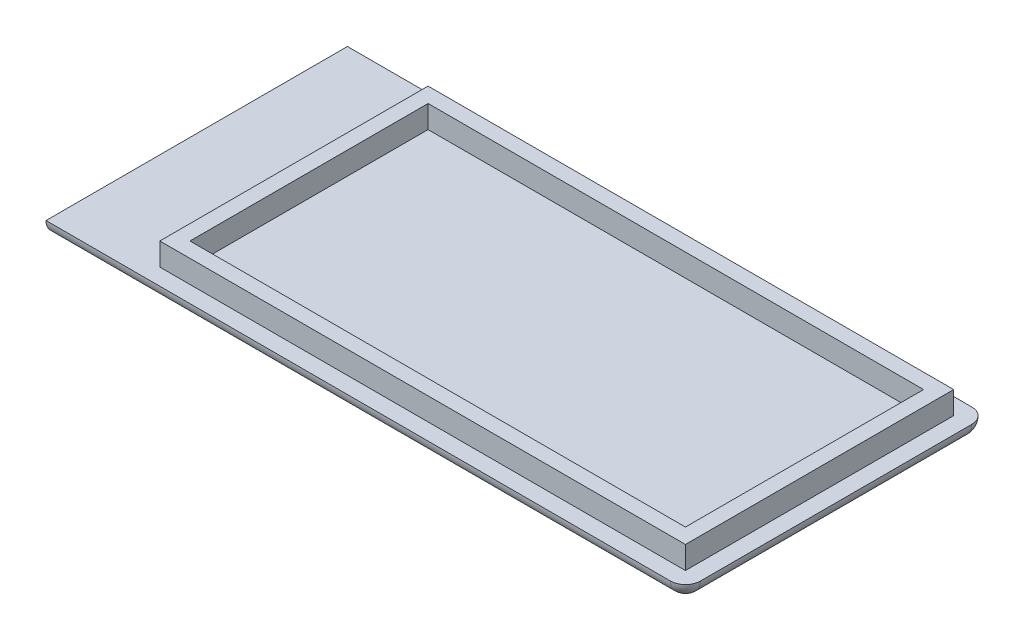
ISO-10303-21;
HEADER;
FILE_DESCRIPTION(('STEP AP214'),'2;1');
FILE_NAME('part.step','',(''),(''),'','','');
FILE_SCHEMA(('AUTOMOTIVE_DESIGN { 1 0 10303 214 1 1 1 1 }'));
ENDSEC;
DATA;
#1=APPLICATION_CONTEXT('core data for automotive mechanical design processes');
#2=APPLICATION_PROTOCOL_DEFINITION('international standard','automotive_design',2000,#1);
#3=PRODUCT_CONTEXT('',#1,'mechanical');
#4=PRODUCT('Part','Part','',(#3));
#5=PRODUCT_RELATED_PRODUCT_CATEGORY('part','',(#4));
#6=PRODUCT_DEFINITION_FORMATION('','',#4);
#7=PRODUCT_DEFINITION_CONTEXT('part definition',#1,'design');
#8=PRODUCT_DEFINITION('design','',#6,#7);
#9=PRODUCT_DEFINITION_SHAPE('','',#8);
#10=(LENGTH_UNIT() NAMED_UNIT(*) SI_UNIT(.MILLI.,.METRE.));
#11=(NAMED_UNIT(*) PLANE_ANGLE_UNIT() SI_UNIT($,.RADIAN.));
#12=(NAMED_UNIT(*) SI_UNIT($,.STERADIAN.) SOLID_ANGLE_UNIT());
#13=UNCERTAINTY_MEASURE_WITH_UNIT(LENGTH_MEASURE(1.E-05),#10,'distance_accuracy_value','');
#14=(GEOMETRIC_REPRESENTATION_CONTEXT(3) GLOBAL_UNCERTAINTY_ASSIGNED_CONTEXT((#13)) GLOBAL_UNIT_ASSIGNED_CONTEXT((#10,
#11,#12)) REPRESENTATION_CONTEXT('',''));
#15=CARTESIAN_POINT('',(0.,0.,0.));
#16=DIRECTION('',(0.,0.,1.));
#17=DIRECTION('',(1.,0.,0.));
#18=AXIS2_PLACEMENT_3D('',#15,#16,#17);
#19=CARTESIAN_POINT('',(0.,1.,19.99996));
#20=DIRECTION('',(0.,-1.,0.));
#21=DIRECTION('',(0.,0.,-1.));
#22=AXIS2_PLACEMENT_3D('',#19,#20,#21);
#23=PLANE('',#22);
#24=DIRECTION('',(-1.,0.,0.));
#25=VECTOR('',#24,1.);
#26=CARTESIAN_POINT('',(0.,1.,19.99996));
#27=LINE('',#26,#25);
#28=CARTESIAN_POINT('',(41.42562,1.,19.99996));
#29=VERTEX_POINT('',#28);
#30=CARTESIAN_POINT('',(0.,1.,19.99996));
#31=VERTEX_POINT('',#30);
#32=EDGE_CURVE('E198',#29,#31,#27,.T.);
#33=ORIENTED_EDGE('',*,*,#32,.F.);
#34=CARTESIAN_POINT('',(41.42562,1.,18.99996));
#35=DIRECTION('',(0.,-1.,0.));
#36=DIRECTION('',(0.,0.,-1.));
#37=AXIS2_PLACEMENT_3D('',#34,#35,#36);
#38=CIRCLE('',#37,1.);
#39=CARTESIAN_POINT('',(42.42562,1.,18.99996));
#40=VERTEX_POINT('',#39);
#41=EDGE_CURVE('E213',#29,#40,#38,.F.);
#42=ORIENTED_EDGE('',*,*,#41,.T.);
#43=DIRECTION('',(0.,0.,-1.));
#44=VECTOR('',#43,1.);
#45=CARTESIAN_POINT('',(42.42562,1.,19.99996));
#46=LINE('',#45,#44);
#47=CARTESIAN_POINT('',(42.42562,1.,1.));
#48=VERTEX_POINT('',#47);
#49=EDGE_CURVE('E206',#40,#48,#46,.T.);
#50=ORIENTED_EDGE('',*,*,#49,.T.);
#51=CARTESIAN_POINT('',(41.42562,1.,1.));
#52=DIRECTION('',(0.,-1.,0.));
#53=DIRECTION('',(0.,0.,-1.));
#54=AXIS2_PLACEMENT_3D('',#51,#52,#53);
#55=CIRCLE('',#54,1.);
#56=CARTESIAN_POINT('',(41.42562,1.,0.));
#57=VERTEX_POINT('',#56);
#58=EDGE_CURVE('E211',#48,#57,#55,.F.);
#59=ORIENTED_EDGE('',*,*,#58,.T.);
#60=DIRECTION('',(-1.,0.,0.));
#61=VECTOR('',#60,1.);
#62=CARTESIAN_POINT('',(0.,1.,0.));
#63=LINE('',#62,#61);
#64=CARTESIAN_POINT('',(0.,1.,0.));
#65=VERTEX_POINT('',#64);
#66=EDGE_CURVE('E202',#57,#65,#63,.T.);
#67=ORIENTED_EDGE('',*,*,#66,.T.);
#68=DIRECTION('',(0.,0.,-1.));
#69=VECTOR('',#68,1.);
#70=CARTESIAN_POINT('',(0.,1.,19.99996));
#71=LINE('',#70,#69);
#72=EDGE_CURVE('E201',#31,#65,#71,.T.);
#73=ORIENTED_EDGE('',*,*,#72,.F.);
#74=EDGE_LOOP('',(#33,#42,#50,#59,#67,#73));
#75=FACE_BOUND('',#74,.T.);
#76=DIRECTION('',(0.,0.,1.));
#77=VECTOR('',#76,1.);
#78=CARTESIAN_POINT('',(6.45142,1.,1.1));
#79=LINE('',#78,#77);
#80=CARTESIAN_POINT('',(6.45142,1.,1.1));
#81=VERTEX_POINT('',#80);
#82=CARTESIAN_POINT('',(6.45142,1.,18.89996));
#83=VERTEX_POINT('',#82);
#84=EDGE_CURVE('E146',#81,#83,#79,.T.);
#85=ORIENTED_EDGE('',*,*,#84,.F.);
#86=DIRECTION('',(-1.,0.,0.));
#87=VECTOR('',#86,1.);
#88=CARTESIAN_POINT('',(6.45142,1.,1.1));
#89=LINE('',#88,#87);
#90=CARTESIAN_POINT('',(41.32562,1.,1.1));
#91=VERTEX_POINT('',#90);
#92=EDGE_CURVE('E174',#91,#81,#89,.T.);
#93=ORIENTED_EDGE('',*,*,#92,.F.);
#94=DIRECTION('',(0.,0.,-1.));
#95=VECTOR('',#94,1.);
#96=CARTESIAN_POINT('',(41.32562,1.,1.1));
#97=LINE('',#96,#95);
#98=CARTESIAN_POINT('',(41.32562,1.,18.89996));
#99=VERTEX_POINT('',#98);
#100=EDGE_CURVE('E55',#99,#91,#97,.T.);
#101=ORIENTED_EDGE('',*,*,#100,.F.);
#102=DIRECTION('',(1.,0.,0.));
#103=VECTOR('',#102,1.);
#104=CARTESIAN_POINT('',(6.45142,1.,18.89996));
#105=LINE('',#104,#103);
#106=EDGE_CURVE('E50',#83,#99,#105,.T.);
#107=ORIENTED_EDGE('',*,*,#106,.F.);
#108=EDGE_LOOP('',(#85,#93,#101,#107));
#109=FACE_BOUND('',#108,.T.);
#110=ADVANCED_FACE('F33',(#75,#109),#23,.F.);
#111=CARTESIAN_POINT('',(0.,0.,19.99996));
#112=DIRECTION('',(1.,0.,0.));
#113=DIRECTION('',(0.,0.,-1.));
#114=AXIS2_PLACEMENT_3D('',#111,#112,#113);
#115=PLANE('',#114);
#116=ORIENTED_EDGE('',*,*,#72,.T.);
#117=CARTESIAN_POINT('',(0.,1.,1.));
#118=DIRECTION('',(1.,0.,0.));
#119=DIRECTION('',(0.,0.,-1.));
#120=AXIS2_PLACEMENT_3D('',#117,#118,#119);
#121=CIRCLE('',#120,1.);
#122=CARTESIAN_POINT('',(0.,0.,1.));
#123=VERTEX_POINT('',#122);
#124=EDGE_CURVE('E11',#65,#123,#121,.F.);
#125=ORIENTED_EDGE('',*,*,#124,.T.);
#126=DIRECTION('',(0.,0.,-1.));
#127=VECTOR('',#126,1.);
#128=CARTESIAN_POINT('',(0.,0.,19.99996));
#129=LINE('',#128,#127);
#130=CARTESIAN_POINT('',(0.,0.,18.99996));
#131=VERTEX_POINT('',#130);
#132=EDGE_CURVE('E208',#131,#123,#129,.T.);
#133=ORIENTED_EDGE('',*,*,#132,.F.);
#134=CARTESIAN_POINT('',(0.,1.,18.99996));
#135=DIRECTION('',(1.,0.,0.));
#136=DIRECTION('',(0.,0.,-1.));
#137=AXIS2_PLACEMENT_3D('',#134,#135,#136);
#138=CIRCLE('',#137,1.);
#139=EDGE_CURVE('E42',#131,#31,#138,.F.);
#140=ORIENTED_EDGE('',*,*,#139,.T.);
#141=EDGE_LOOP('',(#116,#125,#133,#140));
#142=FACE_BOUND('',#141,.T.);
#143=ADVANCED_FACE('F244',(#142),#115,.F.);
#144=CARTESIAN_POINT('',(0.,0.,19.99996));
#145=DIRECTION('',(0.,1.,0.));
#146=DIRECTION('',(0.,0.,1.));
#147=AXIS2_PLACEMENT_3D('',#144,#145,#146);
#148=PLANE('',#147);
#149=ORIENTED_EDGE('',*,*,#132,.T.);
#150=DIRECTION('',(1.,0.,0.));
#151=VECTOR('',#150,1.);
#152=CARTESIAN_POINT('',(42.42562,0.,1.));
#153=LINE('',#152,#151);
#154=CARTESIAN_POINT('',(41.42562,0.,1.));
#155=VERTEX_POINT('',#154);
#156=EDGE_CURVE('E220',#123,#155,#153,.T.);
#157=ORIENTED_EDGE('',*,*,#156,.T.);
#158=DIRECTION('',(0.,0.,-1.));
#159=VECTOR('',#158,1.);
#160=CARTESIAN_POINT('',(41.42562,0.,19.99996));
#161=LINE('',#160,#159);
#162=CARTESIAN_POINT('',(41.42562,0.,18.99996));
#163=VERTEX_POINT('',#162);
#164=EDGE_CURVE('E218',#155,#163,#161,.F.);
#165=ORIENTED_EDGE('',*,*,#164,.T.);
#166=DIRECTION('',(1.,0.,0.));
#167=VECTOR('',#166,1.);
#168=CARTESIAN_POINT('',(0.,0.,18.99996));
#169=LINE('',#168,#167);
#170=EDGE_CURVE('E216',#163,#131,#169,.F.);
#171=ORIENTED_EDGE('',*,*,#170,.T.);
#172=EDGE_LOOP('',(#149,#157,#165,#171));
#173=FACE_BOUND('',#172,.T.);
#174=ADVANCED_FACE('F269',(#173),#148,.F.);
#175=CARTESIAN_POINT('',(0.,1.,1.));
#176=DIRECTION('',(-1.,0.,0.));
#177=DIRECTION('',(0.,0.,1.));
#178=AXIS2_PLACEMENT_3D('',#175,#176,#177);
#179=CYLINDRICAL_SURFACE('',#178,1.);
#180=ORIENTED_EDGE('',*,*,#124,.F.);
#181=ORIENTED_EDGE('',*,*,#66,.F.);
#182=CARTESIAN_POINT('',(41.42562,1.,1.));
#183=DIRECTION('',(1.,0.,0.));
#184=DIRECTION('',(0.,0.,-1.));
#185=AXIS2_PLACEMENT_3D('',#182,#183,#184);
#186=CIRCLE('',#185,1.);
#187=EDGE_CURVE('E37',#155,#57,#186,.T.);
#188=ORIENTED_EDGE('',*,*,#187,.F.);
#189=ORIENTED_EDGE('',*,*,#156,.F.);
#190=EDGE_LOOP('',(#180,#181,#188,#189));
#191=FACE_BOUND('',#190,.T.);
#192=ADVANCED_FACE('F35',(#191),#179,.T.);
#193=CARTESIAN_POINT('',(41.42562,1.,1.));
#194=DIRECTION('',(0.,0.,1.));
#195=DIRECTION('',(1.,0.,0.));
#196=AXIS2_PLACEMENT_3D('',#193,#194,#195);
#197=SPHERICAL_SURFACE('',#196,1.);
#198=ORIENTED_EDGE('',*,*,#187,.T.);
#199=ORIENTED_EDGE('',*,*,#58,.F.);
#200=CARTESIAN_POINT('',(41.42562,1.,1.));
#201=DIRECTION('',(0.,0.,-1.));
#202=DIRECTION('',(-1.,0.,0.));
#203=AXIS2_PLACEMENT_3D('',#200,#201,#202);
#204=CIRCLE('',#203,1.);
#205=EDGE_CURVE('E226',#155,#48,#204,.F.);
#206=ORIENTED_EDGE('',*,*,#205,.F.);
#207=EDGE_LOOP('',(#198,#199,#206));
#208=FACE_BOUND('',#207,.T.);
#209=ADVANCED_FACE('F236',(#208),#197,.T.);
#210=CARTESIAN_POINT('',(41.42562,1.,19.99996));
#211=DIRECTION('',(0.,0.,-1.));
#212=DIRECTION('',(-1.,0.,0.));
#213=AXIS2_PLACEMENT_3D('',#210,#211,#212);
#214=CYLINDRICAL_SURFACE('',#213,1.);
#215=ORIENTED_EDGE('',*,*,#205,.T.);
#216=ORIENTED_EDGE('',*,*,#49,.F.);
#217=CARTESIAN_POINT('',(41.42562,1.,18.99996));
#218=DIRECTION('',(0.,0.,1.));
#219=DIRECTION('',(1.,0.,0.));
#220=AXIS2_PLACEMENT_3D('',#217,#218,#219);
#221=CIRCLE('',#220,1.);
#222=EDGE_CURVE('E225',#163,#40,#221,.T.);
#223=ORIENTED_EDGE('',*,*,#222,.F.);
#224=ORIENTED_EDGE('',*,*,#164,.F.);
#225=EDGE_LOOP('',(#215,#216,#223,#224));
#226=FACE_BOUND('',#225,.T.);
#227=ADVANCED_FACE('F255',(#226),#214,.T.);
#228=CARTESIAN_POINT('',(0.,1.,18.99996));
#229=DIRECTION('',(1.,0.,0.));
#230=DIRECTION('',(0.,0.,-1.));
#231=AXIS2_PLACEMENT_3D('',#228,#229,#230);
#232=CYLINDRICAL_SURFACE('',#231,1.);
#233=ORIENTED_EDGE('',*,*,#139,.F.);
#234=ORIENTED_EDGE('',*,*,#170,.F.);
#235=CARTESIAN_POINT('',(41.42562,1.,18.99996));
#236=DIRECTION('',(1.,0.,0.));
#237=DIRECTION('',(0.,0.,-1.));
#238=AXIS2_PLACEMENT_3D('',#235,#236,#237);
#239=CIRCLE('',#238,1.);
#240=EDGE_CURVE('E197',#29,#163,#239,.T.);
#241=ORIENTED_EDGE('',*,*,#240,.F.);
#242=ORIENTED_EDGE('',*,*,#32,.T.);
#243=EDGE_LOOP('',(#233,#234,#241,#242));
#244=FACE_BOUND('',#243,.T.);
#245=ADVANCED_FACE('F249',(#244),#232,.T.);
#246=CARTESIAN_POINT('',(41.42562,1.,18.99996));
#247=DIRECTION('',(0.,0.,1.));
#248=DIRECTION('',(1.,0.,0.));
#249=AXIS2_PLACEMENT_3D('',#246,#247,#248);
#250=SPHERICAL_SURFACE('',#249,1.);
#251=ORIENTED_EDGE('',*,*,#41,.F.);
#252=ORIENTED_EDGE('',*,*,#240,.T.);
#253=ORIENTED_EDGE('',*,*,#222,.T.);
#254=EDGE_LOOP('',(#251,#252,#253));
#255=FACE_BOUND('',#254,.T.);
#256=ADVANCED_FACE('F254',(#255),#250,.T.);
#257=CARTESIAN_POINT('',(0.,2.5,0.));
#258=DIRECTION('',(0.,1.,0.));
#259=DIRECTION('',(0.,0.,1.));
#260=AXIS2_PLACEMENT_3D('',#257,#258,#259);
#261=PLANE('',#260);
#262=DIRECTION('',(0.,0.,1.));
#263=VECTOR('',#262,1.);
#264=CARTESIAN_POINT('',(6.45142,2.5,1.1));
#265=LINE('',#264,#263);
#266=CARTESIAN_POINT('',(6.45142,2.5,1.1));
#267=VERTEX_POINT('',#266);
#268=CARTESIAN_POINT('',(6.45142,2.5,18.89996));
#269=VERTEX_POINT('',#268);
#270=EDGE_CURVE('E170',#267,#269,#265,.T.);
#271=ORIENTED_EDGE('',*,*,#270,.T.);
#272=DIRECTION('',(1.,0.,0.));
#273=VECTOR('',#272,1.);
#274=CARTESIAN_POINT('',(6.45142,2.5,18.89996));
#275=LINE('',#274,#273);
#276=CARTESIAN_POINT('',(41.32562,2.5,18.89996));
#277=VERTEX_POINT('',#276);
#278=EDGE_CURVE('E173',#269,#277,#275,.T.);
#279=ORIENTED_EDGE('',*,*,#278,.T.);
#280=DIRECTION('',(0.,0.,-1.));
#281=VECTOR('',#280,1.);
#282=CARTESIAN_POINT('',(41.32562,2.5,1.1));
#283=LINE('',#282,#281);
#284=CARTESIAN_POINT('',(41.32562,2.5,1.1));
#285=VERTEX_POINT('',#284);
#286=EDGE_CURVE('E176',#277,#285,#283,.T.);
#287=ORIENTED_EDGE('',*,*,#286,.T.);
#288=DIRECTION('',(-1.,0.,0.));
#289=VECTOR('',#288,1.);
#290=CARTESIAN_POINT('',(6.45142,2.5,1.1));
#291=LINE('',#290,#289);
#292=EDGE_CURVE('E178',#285,#267,#291,.T.);
#293=ORIENTED_EDGE('',*,*,#292,.T.);
#294=EDGE_LOOP('',(#271,#279,#287,#293));
#295=FACE_BOUND('',#294,.T.);
#296=DIRECTION('',(0.,0.,1.));
#297=VECTOR('',#296,1.);
#298=CARTESIAN_POINT('',(7.45142,2.5,2.1));
#299=LINE('',#298,#297);
#300=CARTESIAN_POINT('',(7.45142,2.5,2.1));
#301=VERTEX_POINT('',#300);
#302=CARTESIAN_POINT('',(7.45142,2.5,17.89996));
#303=VERTEX_POINT('',#302);
#304=EDGE_CURVE('E138',#301,#303,#299,.T.);
#305=ORIENTED_EDGE('',*,*,#304,.F.);
#306=DIRECTION('',(-1.,0.,0.));
#307=VECTOR('',#306,1.);
#308=CARTESIAN_POINT('',(7.45142,2.5,2.1));
#309=LINE('',#308,#307);
#310=CARTESIAN_POINT('',(40.32562,2.5,2.1));
#311=VERTEX_POINT('',#310);
#312=EDGE_CURVE('E128',#311,#301,#309,.T.);
#313=ORIENTED_EDGE('',*,*,#312,.F.);
#314=DIRECTION('',(0.,0.,-1.));
#315=VECTOR('',#314,1.);
#316=CARTESIAN_POINT('',(40.32562,2.5,2.1));
#317=LINE('',#316,#315);
#318=CARTESIAN_POINT('',(40.32562,2.5,17.89996));
#319=VERTEX_POINT('',#318);
#320=EDGE_CURVE('E154',#319,#311,#317,.T.);
#321=ORIENTED_EDGE('',*,*,#320,.F.);
#322=DIRECTION('',(1.,0.,0.));
#323=VECTOR('',#322,1.);
#324=CARTESIAN_POINT('',(7.45142,2.5,17.89996));
#325=LINE('',#324,#323);
#326=EDGE_CURVE('E152',#303,#319,#325,.T.);
#327=ORIENTED_EDGE('',*,*,#326,.F.);
#328=EDGE_LOOP('',(#305,#313,#321,#327));
#329=FACE_BOUND('',#328,.T.);
#330=ADVANCED_FACE('F150',(#295,#329),#261,.T.);
#331=CARTESIAN_POINT('',(6.45142,2.5,1.1));
#332=DIRECTION('',(1.,0.,0.));
#333=DIRECTION('',(0.,0.,-1.));
#334=AXIS2_PLACEMENT_3D('',#331,#332,#333);
#335=PLANE('',#334);
#336=ORIENTED_EDGE('',*,*,#84,.T.);
#337=DIRECTION('',(0.,-1.,0.));
#338=VECTOR('',#337,1.);
#339=CARTESIAN_POINT('',(6.45142,2.5,18.89996));
#340=LINE('',#339,#338);
#341=EDGE_CURVE('E195',#269,#83,#340,.T.);
#342=ORIENTED_EDGE('',*,*,#341,.F.);
#343=ORIENTED_EDGE('',*,*,#270,.F.);
#344=DIRECTION('',(0.,-1.,0.));
#345=VECTOR('',#344,1.);
#346=CARTESIAN_POINT('',(6.45142,2.5,1.1));
#347=LINE('',#346,#345);
#348=EDGE_CURVE('E180',#267,#81,#347,.T.);
#349=ORIENTED_EDGE('',*,*,#348,.T.);
#350=EDGE_LOOP('',(#336,#342,#343,#349));
#351=FACE_BOUND('',#350,.T.);
#352=ADVANCED_FACE('F297',(#351),#335,.F.);
#353=CARTESIAN_POINT('',(6.45142,2.5,18.89996));
#354=DIRECTION('',(0.,0.,-1.));
#355=DIRECTION('',(-1.,0.,0.));
#356=AXIS2_PLACEMENT_3D('',#353,#354,#355);
#357=PLANE('',#356);
#358=ORIENTED_EDGE('',*,*,#106,.T.);
#359=DIRECTION('',(0.,-1.,0.));
#360=VECTOR('',#359,1.);
#361=CARTESIAN_POINT('',(41.32562,2.5,18.89996));
#362=LINE('',#361,#360);
#363=EDGE_CURVE('E192',#277,#99,#362,.T.);
#364=ORIENTED_EDGE('',*,*,#363,.F.);
#365=ORIENTED_EDGE('',*,*,#278,.F.);
#366=ORIENTED_EDGE('',*,*,#341,.T.);
#367=EDGE_LOOP('',(#358,#364,#365,#366));
#368=FACE_BOUND('',#367,.T.);
#369=ADVANCED_FACE('F305',(#368),#357,.F.);
#370=CARTESIAN_POINT('',(41.32562,2.5,1.1));
#371=DIRECTION('',(-1.,0.,0.));
#372=DIRECTION('',(0.,0.,1.));
#373=AXIS2_PLACEMENT_3D('',#370,#371,#372);
#374=PLANE('',#373);
#375=ORIENTED_EDGE('',*,*,#100,.T.);
#376=DIRECTION('',(0.,-1.,0.));
#377=VECTOR('',#376,1.);
#378=CARTESIAN_POINT('',(41.32562,2.5,1.1));
#379=LINE('',#378,#377);
#380=EDGE_CURVE('E189',#285,#91,#379,.T.);
#381=ORIENTED_EDGE('',*,*,#380,.F.);
#382=ORIENTED_EDGE('',*,*,#286,.F.);
#383=ORIENTED_EDGE('',*,*,#363,.T.);
#384=EDGE_LOOP('',(#375,#381,#382,#383));
#385=FACE_BOUND('',#384,.T.);
#386=ADVANCED_FACE('F301',(#385),#374,.F.);
#387=CARTESIAN_POINT('',(6.45142,2.5,1.1));
#388=DIRECTION('',(0.,0.,1.));
#389=DIRECTION('',(1.,0.,0.));
#390=AXIS2_PLACEMENT_3D('',#387,#388,#389);
#391=PLANE('',#390);
#392=ORIENTED_EDGE('',*,*,#92,.T.);
#393=ORIENTED_EDGE('',*,*,#348,.F.);
#394=ORIENTED_EDGE('',*,*,#292,.F.);
#395=ORIENTED_EDGE('',*,*,#380,.T.);
#396=EDGE_LOOP('',(#392,#393,#394,#395));
#397=FACE_BOUND('',#396,.T.);
#398=ADVANCED_FACE('F294',(#397),#391,.F.);
#399=CARTESIAN_POINT('',(7.45142,2.5,2.1));
#400=DIRECTION('',(0.,0.,1.));
#401=DIRECTION('',(1.,0.,0.));
#402=AXIS2_PLACEMENT_3D('',#399,#400,#401);
#403=PLANE('',#402);
#404=DIRECTION('',(-1.,0.,0.));
#405=VECTOR('',#404,1.);
#406=CARTESIAN_POINT('',(7.45142,1.,2.1));
#407=LINE('',#406,#405);
#408=CARTESIAN_POINT('',(40.32562,1.,2.1));
#409=VERTEX_POINT('',#408);
#410=CARTESIAN_POINT('',(7.45142,1.,2.1));
#411=VERTEX_POINT('',#410);
#412=EDGE_CURVE('E158',#409,#411,#407,.T.);
#413=ORIENTED_EDGE('',*,*,#412,.F.);
#414=DIRECTION('',(0.,-1.,0.));
#415=VECTOR('',#414,1.);
#416=CARTESIAN_POINT('',(40.32562,2.5,2.1));
#417=LINE('',#416,#415);
#418=EDGE_CURVE('E134',#311,#409,#417,.T.);
#419=ORIENTED_EDGE('',*,*,#418,.F.);
#420=ORIENTED_EDGE('',*,*,#312,.T.);
#421=DIRECTION('',(0.,-1.,0.));
#422=VECTOR('',#421,1.);
#423=CARTESIAN_POINT('',(7.45142,2.5,2.1));
#424=LINE('',#423,#422);
#425=EDGE_CURVE('E132',#301,#411,#424,.T.);
#426=ORIENTED_EDGE('',*,*,#425,.T.);
#427=EDGE_LOOP('',(#413,#419,#420,#426));
#428=FACE_BOUND('',#427,.T.);
#429=ADVANCED_FACE('F131',(#428),#403,.T.);
#430=CARTESIAN_POINT('',(7.45142,2.5,2.1));
#431=DIRECTION('',(1.,0.,0.));
#432=DIRECTION('',(0.,0.,-1.));
#433=AXIS2_PLACEMENT_3D('',#430,#431,#432);
#434=PLANE('',#433);
#435=DIRECTION('',(0.,0.,1.));
#436=VECTOR('',#435,1.);
#437=CARTESIAN_POINT('',(7.45142,1.,2.1));
#438=LINE('',#437,#436);
#439=CARTESIAN_POINT('',(7.45142,1.,17.89996));
#440=VERTEX_POINT('',#439);
#441=EDGE_CURVE('E145',#411,#440,#438,.T.);
#442=ORIENTED_EDGE('',*,*,#441,.F.);
#443=ORIENTED_EDGE('',*,*,#425,.F.);
#444=ORIENTED_EDGE('',*,*,#304,.T.);
#445=DIRECTION('',(0.,-1.,0.));
#446=VECTOR('',#445,1.);
#447=CARTESIAN_POINT('',(7.45142,2.5,17.89996));
#448=LINE('',#447,#446);
#449=EDGE_CURVE('E147',#303,#440,#448,.T.);
#450=ORIENTED_EDGE('',*,*,#449,.T.);
#451=EDGE_LOOP('',(#442,#443,#444,#450));
#452=FACE_BOUND('',#451,.T.);
#453=ADVANCED_FACE('F142',(#452),#434,.T.);
#454=CARTESIAN_POINT('',(7.45142,2.5,17.89996));
#455=DIRECTION('',(0.,0.,-1.));
#456=DIRECTION('',(-1.,0.,0.));
#457=AXIS2_PLACEMENT_3D('',#454,#455,#456);
#458=PLANE('',#457);
#459=DIRECTION('',(1.,0.,0.));
#460=VECTOR('',#459,1.);
#461=CARTESIAN_POINT('',(7.45142,1.,17.89996));
#462=LINE('',#461,#460);
#463=CARTESIAN_POINT('',(40.32562,1.,17.89996));
#464=VERTEX_POINT('',#463);
#465=EDGE_CURVE('E161',#440,#464,#462,.T.);
#466=ORIENTED_EDGE('',*,*,#465,.F.);
#467=ORIENTED_EDGE('',*,*,#449,.F.);
#468=ORIENTED_EDGE('',*,*,#326,.T.);
#469=DIRECTION('',(0.,-1.,0.));
#470=VECTOR('',#469,1.);
#471=CARTESIAN_POINT('',(40.32562,2.5,17.89996));
#472=LINE('',#471,#470);
#473=EDGE_CURVE('E167',#319,#464,#472,.T.);
#474=ORIENTED_EDGE('',*,*,#473,.T.);
#475=EDGE_LOOP('',(#466,#467,#468,#474));
#476=FACE_BOUND('',#475,.T.);
#477=ADVANCED_FACE('F279',(#476),#458,.T.);
#478=CARTESIAN_POINT('',(40.32562,2.5,2.1));
#479=DIRECTION('',(-1.,0.,0.));
#480=DIRECTION('',(0.,0.,1.));
#481=AXIS2_PLACEMENT_3D('',#478,#479,#480);
#482=PLANE('',#481);
#483=DIRECTION('',(0.,0.,-1.));
#484=VECTOR('',#483,1.);
#485=CARTESIAN_POINT('',(40.32562,1.,2.1));
#486=LINE('',#485,#484);
#487=EDGE_CURVE('E139',#464,#409,#486,.T.);
#488=ORIENTED_EDGE('',*,*,#487,.F.);
#489=ORIENTED_EDGE('',*,*,#473,.F.);
#490=ORIENTED_EDGE('',*,*,#320,.T.);
#491=ORIENTED_EDGE('',*,*,#418,.T.);
#492=EDGE_LOOP('',(#488,#489,#490,#491));
#493=FACE_BOUND('',#492,.T.);
#494=ADVANCED_FACE('F274',(#493),#482,.T.);
#495=ORIENTED_EDGE('',*,*,#487,.T.);
#496=ORIENTED_EDGE('',*,*,#412,.T.);
#497=ORIENTED_EDGE('',*,*,#441,.T.);
#498=ORIENTED_EDGE('',*,*,#465,.T.);
#499=EDGE_LOOP('',(#495,#496,#497,#498));
#500=FACE_BOUND('',#499,.T.);
#501=ADVANCED_FACE('F265',(#500),#23,.F.);
#502=CLOSED_SHELL('',(#110,#143,#174,#192,#209,#227,#245,#256,#330,#352,#369,#386,#398,#429,
#453,#477,#494,#501));
#503=MANIFOLD_SOLID_BREP('B2',#502);
#504=ADVANCED_BREP_SHAPE_REPRESENTATION('',(#18,#503),#14);
#505=SHAPE_DEFINITION_REPRESENTATION(#9,#504);
ENDSEC;
END-ISO-10303-21;
